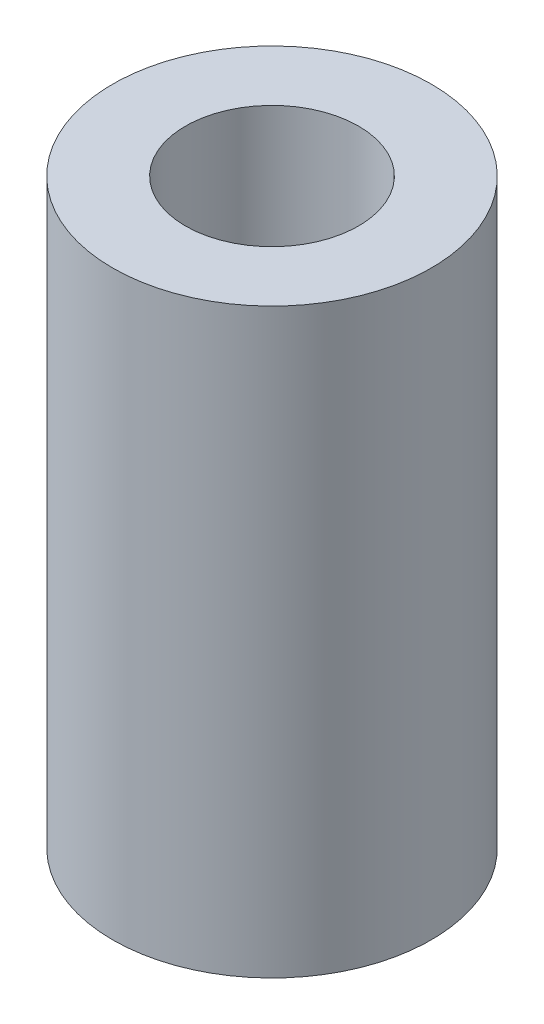
ISO-10303-21;
HEADER;
FILE_DESCRIPTION(('STEP AP214'),'2;1');
FILE_NAME('part.step','',(''),(''),'','','');
FILE_SCHEMA(('AUTOMOTIVE_DESIGN { 1 0 10303 214 1 1 1 1 }'));
ENDSEC;
DATA;
#1=APPLICATION_CONTEXT('core data for automotive mechanical design processes');
#2=APPLICATION_PROTOCOL_DEFINITION('international standard','automotive_design',2000,#1);
#3=PRODUCT_CONTEXT('',#1,'mechanical');
#4=PRODUCT('Part','Part','',(#3));
#5=PRODUCT_RELATED_PRODUCT_CATEGORY('part','',(#4));
#6=PRODUCT_DEFINITION_FORMATION('','',#4);
#7=PRODUCT_DEFINITION_CONTEXT('part definition',#1,'design');
#8=PRODUCT_DEFINITION('design','',#6,#7);
#9=PRODUCT_DEFINITION_SHAPE('','',#8);
#10=(LENGTH_UNIT() NAMED_UNIT(*) SI_UNIT(.MILLI.,.METRE.));
#11=(NAMED_UNIT(*) PLANE_ANGLE_UNIT() SI_UNIT($,.RADIAN.));
#12=(NAMED_UNIT(*) SI_UNIT($,.STERADIAN.) SOLID_ANGLE_UNIT());
#13=UNCERTAINTY_MEASURE_WITH_UNIT(LENGTH_MEASURE(1.E-05),#10,'distance_accuracy_value','');
#14=(GEOMETRIC_REPRESENTATION_CONTEXT(3) GLOBAL_UNCERTAINTY_ASSIGNED_CONTEXT((#13)) GLOBAL_UNIT_ASSIGNED_CONTEXT((#10,
#11,#12)) REPRESENTATION_CONTEXT('',''));
#15=CARTESIAN_POINT('',(0.,0.,0.));
#16=DIRECTION('',(0.,0.,1.));
#17=DIRECTION('',(1.,0.,0.));
#18=AXIS2_PLACEMENT_3D('',#15,#16,#17);
#19=CARTESIAN_POINT('',(0.,14.,0.));
#20=DIRECTION('',(0.,1.,0.));
#21=DIRECTION('',(0.,0.,1.));
#22=AXIS2_PLACEMENT_3D('',#19,#20,#21);
#23=PLANE('',#22);
#24=CARTESIAN_POINT('',(0.,14.,0.));
#25=DIRECTION('',(0.,1.,0.));
#26=DIRECTION('',(0.,0.,1.));
#27=AXIS2_PLACEMENT_3D('',#24,#25,#26);
#28=CIRCLE('',#27,3.8328);
#29=CARTESIAN_POINT('',(0.,14.,3.8328));
#30=VERTEX_POINT('',#29);
#31=EDGE_CURVE('E10',#30,#30,#28,.T.);
#32=ORIENTED_EDGE('',*,*,#31,.T.);
#33=EDGE_LOOP('',(#32));
#34=FACE_BOUND('',#33,.T.);
#35=CARTESIAN_POINT('',(0.,14.,0.));
#36=DIRECTION('',(0.,1.,0.));
#37=DIRECTION('',(0.,0.,1.));
#38=AXIS2_PLACEMENT_3D('',#35,#36,#37);
#39=CIRCLE('',#38,2.0828);
#40=CARTESIAN_POINT('',(0.,14.,2.0828));
#41=VERTEX_POINT('',#40);
#42=EDGE_CURVE('E43',#41,#41,#39,.T.);
#43=ORIENTED_EDGE('',*,*,#42,.F.);
#44=EDGE_LOOP('',(#43));
#45=FACE_BOUND('',#44,.T.);
#46=ADVANCED_FACE('F32',(#34,#45),#23,.T.);
#47=CARTESIAN_POINT('',(0.,0.,0.));
#48=DIRECTION('',(0.,1.,0.));
#49=DIRECTION('',(0.,0.,1.));
#50=AXIS2_PLACEMENT_3D('',#47,#48,#49);
#51=PLANE('',#50);
#52=CARTESIAN_POINT('',(0.,0.,0.));
#53=DIRECTION('',(0.,1.,0.));
#54=DIRECTION('',(0.,0.,1.));
#55=AXIS2_PLACEMENT_3D('',#52,#53,#54);
#56=CIRCLE('',#55,3.8328);
#57=CARTESIAN_POINT('',(0.,0.,3.8328));
#58=VERTEX_POINT('',#57);
#59=EDGE_CURVE('E36',#58,#58,#56,.T.);
#60=ORIENTED_EDGE('',*,*,#59,.F.);
#61=EDGE_LOOP('',(#60));
#62=FACE_BOUND('',#61,.T.);
#63=CARTESIAN_POINT('',(0.,0.,0.));
#64=DIRECTION('',(0.,1.,0.));
#65=DIRECTION('',(0.,0.,1.));
#66=AXIS2_PLACEMENT_3D('',#63,#64,#65);
#67=CIRCLE('',#66,2.0828);
#68=CARTESIAN_POINT('',(0.,0.,2.0828));
#69=VERTEX_POINT('',#68);
#70=EDGE_CURVE('E45',#69,#69,#67,.T.);
#71=ORIENTED_EDGE('',*,*,#70,.T.);
#72=EDGE_LOOP('',(#71));
#73=FACE_BOUND('',#72,.T.);
#74=ADVANCED_FACE('F55',(#62,#73),#51,.F.);
#75=CARTESIAN_POINT('',(0.,14.,0.));
#76=DIRECTION('',(0.,-1.,0.));
#77=DIRECTION('',(0.,0.,-1.));
#78=AXIS2_PLACEMENT_3D('',#75,#76,#77);
#79=CYLINDRICAL_SURFACE('',#78,3.8328);
#80=ORIENTED_EDGE('',*,*,#31,.F.);
#81=EDGE_LOOP('',(#80));
#82=FACE_BOUND('',#81,.T.);
#83=ORIENTED_EDGE('',*,*,#59,.T.);
#84=EDGE_LOOP('',(#83));
#85=FACE_BOUND('',#84,.T.);
#86=ADVANCED_FACE('F34',(#82,#85),#79,.T.);
#87=CARTESIAN_POINT('',(0.,14.,0.));
#88=DIRECTION('',(0.,-1.,0.));
#89=DIRECTION('',(0.,0.,-1.));
#90=AXIS2_PLACEMENT_3D('',#87,#88,#89);
#91=CYLINDRICAL_SURFACE('',#90,2.0828);
#92=ORIENTED_EDGE('',*,*,#42,.T.);
#93=EDGE_LOOP('',(#92));
#94=FACE_BOUND('',#93,.T.);
#95=ORIENTED_EDGE('',*,*,#70,.F.);
#96=EDGE_LOOP('',(#95));
#97=FACE_BOUND('',#96,.T.);
#98=ADVANCED_FACE('F51',(#94,#97),#91,.F.);
#99=CLOSED_SHELL('',(#46,#74,#86,#98));
#100=MANIFOLD_SOLID_BREP('B2',#99);
#101=ADVANCED_BREP_SHAPE_REPRESENTATION('',(#18,#100),#14);
#102=SHAPE_DEFINITION_REPRESENTATION(#9,#101);
ENDSEC;
END-ISO-10303-21;
